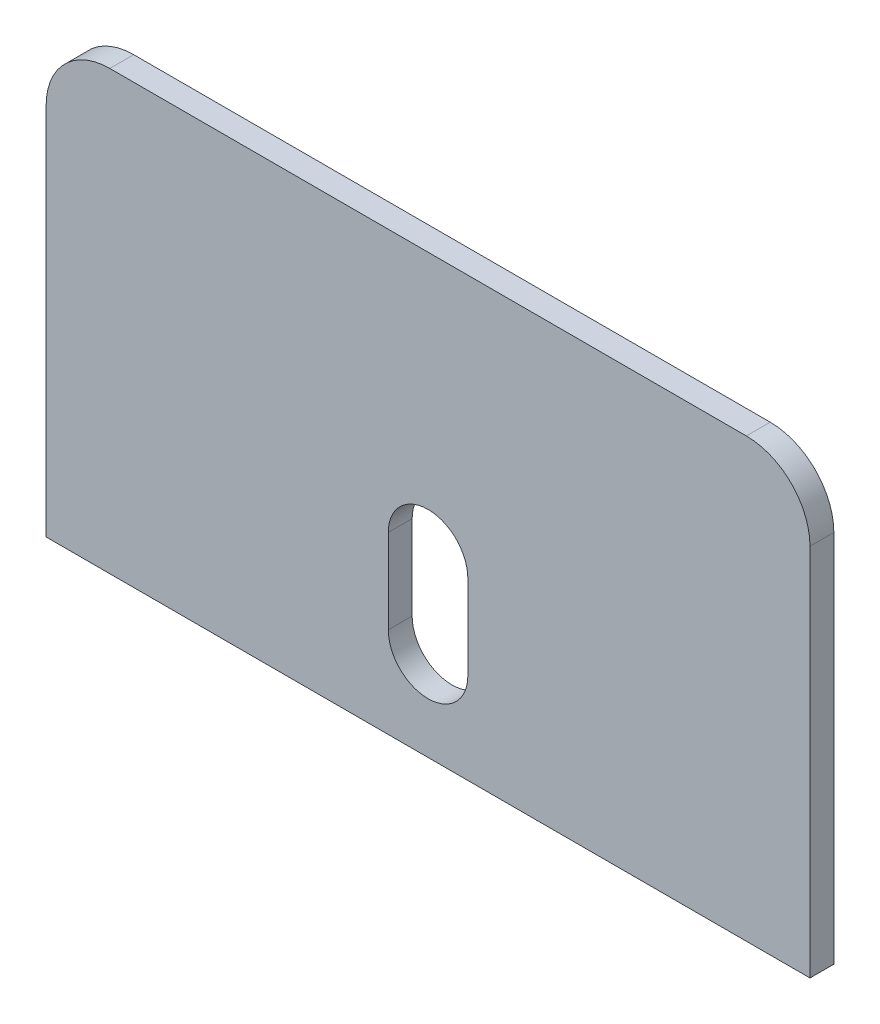
ISO-10303-21;
HEADER;
FILE_DESCRIPTION(('STEP AP214'),'2;1');
FILE_NAME('part.step','',(''),(''),'','','');
FILE_SCHEMA(('AUTOMOTIVE_DESIGN { 1 0 10303 214 1 1 1 1 }'));
ENDSEC;
DATA;
#1=APPLICATION_CONTEXT('core data for automotive mechanical design processes');
#2=APPLICATION_PROTOCOL_DEFINITION('international standard','automotive_design',2000,#1);
#3=PRODUCT_CONTEXT('',#1,'mechanical');
#4=PRODUCT('Part','Part','',(#3));
#5=PRODUCT_RELATED_PRODUCT_CATEGORY('part','',(#4));
#6=PRODUCT_DEFINITION_FORMATION('','',#4);
#7=PRODUCT_DEFINITION_CONTEXT('part definition',#1,'design');
#8=PRODUCT_DEFINITION('design','',#6,#7);
#9=PRODUCT_DEFINITION_SHAPE('','',#8);
#10=(LENGTH_UNIT() NAMED_UNIT(*) SI_UNIT(.MILLI.,.METRE.));
#11=(NAMED_UNIT(*) PLANE_ANGLE_UNIT() SI_UNIT($,.RADIAN.));
#12=(NAMED_UNIT(*) SI_UNIT($,.STERADIAN.) SOLID_ANGLE_UNIT());
#13=UNCERTAINTY_MEASURE_WITH_UNIT(LENGTH_MEASURE(1.E-05),#10,'distance_accuracy_value','');
#14=(GEOMETRIC_REPRESENTATION_CONTEXT(3) GLOBAL_UNCERTAINTY_ASSIGNED_CONTEXT((#13)) GLOBAL_UNIT_ASSIGNED_CONTEXT((#10,
#11,#12)) REPRESENTATION_CONTEXT('',''));
#15=CARTESIAN_POINT('',(0.,0.,0.));
#16=DIRECTION('',(0.,0.,1.));
#17=DIRECTION('',(1.,0.,0.));
#18=AXIS2_PLACEMENT_3D('',#15,#16,#17);
#19=CARTESIAN_POINT('',(0.,0.,1.5));
#20=DIRECTION('',(0.,0.,1.));
#21=DIRECTION('',(1.,0.,0.));
#22=AXIS2_PLACEMENT_3D('',#19,#20,#21);
#23=PLANE('',#22);
#24=DIRECTION('',(0.,1.,0.));
#25=VECTOR('',#24,1.);
#26=CARTESIAN_POINT('',(48.,-27.5,1.5));
#27=LINE('',#26,#25);
#28=CARTESIAN_POINT('',(48.,-27.5,1.5));
#29=VERTEX_POINT('',#28);
#30=CARTESIAN_POINT('',(48.,19.5,1.5));
#31=VERTEX_POINT('',#30);
#32=EDGE_CURVE('E997',#29,#31,#27,.T.);
#33=ORIENTED_EDGE('',*,*,#32,.T.);
#34=CARTESIAN_POINT('',(40.,19.5,1.5));
#35=DIRECTION('',(0.,0.,1.));
#36=DIRECTION('',(1.,0.,0.));
#37=AXIS2_PLACEMENT_3D('',#34,#35,#36);
#38=CIRCLE('',#37,8.);
#39=CARTESIAN_POINT('',(40.,27.5,1.5));
#40=VERTEX_POINT('',#39);
#41=EDGE_CURVE('E60',#31,#40,#38,.T.);
#42=ORIENTED_EDGE('',*,*,#41,.T.);
#43=DIRECTION('',(-1.,0.,0.));
#44=VECTOR('',#43,1.);
#45=CARTESIAN_POINT('',(48.,27.5,1.5));
#46=LINE('',#45,#44);
#47=CARTESIAN_POINT('',(-40.,27.5,1.5));
#48=VERTEX_POINT('',#47);
#49=EDGE_CURVE('E343',#40,#48,#46,.T.);
#50=ORIENTED_EDGE('',*,*,#49,.T.);
#51=CARTESIAN_POINT('',(-40.,19.5,1.5));
#52=DIRECTION('',(0.,0.,1.));
#53=DIRECTION('',(1.,0.,0.));
#54=AXIS2_PLACEMENT_3D('',#51,#52,#53);
#55=CIRCLE('',#54,8.);
#56=CARTESIAN_POINT('',(-48.,19.5,1.5));
#57=VERTEX_POINT('',#56);
#58=EDGE_CURVE('E67',#48,#57,#55,.T.);
#59=ORIENTED_EDGE('',*,*,#58,.T.);
#60=DIRECTION('',(0.,-1.,0.));
#61=VECTOR('',#60,1.);
#62=CARTESIAN_POINT('',(-48.,-27.5,1.5));
#63=LINE('',#62,#61);
#64=CARTESIAN_POINT('',(-48.,-27.5,1.5));
#65=VERTEX_POINT('',#64);
#66=EDGE_CURVE('E243',#57,#65,#63,.T.);
#67=ORIENTED_EDGE('',*,*,#66,.T.);
#68=DIRECTION('',(1.,0.,0.));
#69=VECTOR('',#68,1.);
#70=CARTESIAN_POINT('',(48.,-27.5,1.5));
#71=LINE('',#70,#69);
#72=EDGE_CURVE('E993',#65,#29,#71,.T.);
#73=ORIENTED_EDGE('',*,*,#72,.T.);
#74=EDGE_LOOP('',(#33,#42,#50,#59,#67,#73));
#75=FACE_BOUND('',#74,.T.);
#76=DIRECTION('',(0.,1.,0.));
#77=VECTOR('',#76,1.);
#78=CARTESIAN_POINT('',(5.,-16.1,1.5));
#79=LINE('',#78,#77);
#80=CARTESIAN_POINT('',(5.,-16.1,1.5));
#81=VERTEX_POINT('',#80);
#82=CARTESIAN_POINT('',(5.,-5.5,1.5));
#83=VERTEX_POINT('',#82);
#84=EDGE_CURVE('E145',#81,#83,#79,.T.);
#85=ORIENTED_EDGE('',*,*,#84,.F.);
#86=CARTESIAN_POINT('',(0.,-16.1,1.5));
#87=DIRECTION('',(0.,0.,1.));
#88=DIRECTION('',(1.,0.,0.));
#89=AXIS2_PLACEMENT_3D('',#86,#87,#88);
#90=CIRCLE('',#89,5.);
#91=CARTESIAN_POINT('',(-5.,-16.1,1.5));
#92=VERTEX_POINT('',#91);
#93=EDGE_CURVE('E134',#92,#81,#90,.T.);
#94=ORIENTED_EDGE('',*,*,#93,.F.);
#95=DIRECTION('',(0.,-1.,0.));
#96=VECTOR('',#95,1.);
#97=CARTESIAN_POINT('',(-5.,-16.1,1.5));
#98=LINE('',#97,#96);
#99=CARTESIAN_POINT('',(-5.,-5.5,1.5));
#100=VERTEX_POINT('',#99);
#101=EDGE_CURVE('E165',#100,#92,#98,.T.);
#102=ORIENTED_EDGE('',*,*,#101,.F.);
#103=CARTESIAN_POINT('',(0.,-5.50000000000001,1.5));
#104=DIRECTION('',(0.,0.,1.));
#105=DIRECTION('',(1.,0.,0.));
#106=AXIS2_PLACEMENT_3D('',#103,#104,#105);
#107=CIRCLE('',#106,5.);
#108=EDGE_CURVE('E159',#83,#100,#107,.T.);
#109=ORIENTED_EDGE('',*,*,#108,.F.);
#110=EDGE_LOOP('',(#85,#94,#102,#109));
#111=FACE_BOUND('',#110,.T.);
#112=ADVANCED_FACE('F51',(#75,#111),#23,.T.);
#113=CARTESIAN_POINT('',(0.,0.,-1.5));
#114=DIRECTION('',(0.,0.,1.));
#115=DIRECTION('',(1.,0.,0.));
#116=AXIS2_PLACEMENT_3D('',#113,#114,#115);
#117=PLANE('',#116);
#118=DIRECTION('',(-1.,0.,0.));
#119=VECTOR('',#118,1.);
#120=CARTESIAN_POINT('',(48.,27.5,-1.5));
#121=LINE('',#120,#119);
#122=CARTESIAN_POINT('',(40.,27.5,-1.5));
#123=VERTEX_POINT('',#122);
#124=CARTESIAN_POINT('',(-40.,27.5,-1.5));
#125=VERTEX_POINT('',#124);
#126=EDGE_CURVE('E344',#123,#125,#121,.T.);
#127=ORIENTED_EDGE('',*,*,#126,.F.);
#128=CARTESIAN_POINT('',(40.,19.5,-1.5));
#129=DIRECTION('',(0.,0.,1.));
#130=DIRECTION('',(1.,0.,0.));
#131=AXIS2_PLACEMENT_3D('',#128,#129,#130);
#132=CIRCLE('',#131,8.);
#133=CARTESIAN_POINT('',(48.,19.5,-1.5));
#134=VERTEX_POINT('',#133);
#135=EDGE_CURVE('E1013',#123,#134,#132,.F.);
#136=ORIENTED_EDGE('',*,*,#135,.T.);
#137=DIRECTION('',(0.,1.,0.));
#138=VECTOR('',#137,1.);
#139=CARTESIAN_POINT('',(48.,-27.5,-1.5));
#140=LINE('',#139,#138);
#141=CARTESIAN_POINT('',(48.,-27.5,-1.5));
#142=VERTEX_POINT('',#141);
#143=EDGE_CURVE('E982',#142,#134,#140,.T.);
#144=ORIENTED_EDGE('',*,*,#143,.F.);
#145=DIRECTION('',(1.,0.,0.));
#146=VECTOR('',#145,1.);
#147=CARTESIAN_POINT('',(48.,-27.5,-1.5));
#148=LINE('',#147,#146);
#149=CARTESIAN_POINT('',(-48.,-27.5,-1.5));
#150=VERTEX_POINT('',#149);
#151=EDGE_CURVE('E978',#150,#142,#148,.T.);
#152=ORIENTED_EDGE('',*,*,#151,.F.);
#153=DIRECTION('',(0.,-1.,0.));
#154=VECTOR('',#153,1.);
#155=CARTESIAN_POINT('',(-48.,-27.5,-1.5));
#156=LINE('',#155,#154);
#157=CARTESIAN_POINT('',(-48.,19.5,-1.5));
#158=VERTEX_POINT('',#157);
#159=EDGE_CURVE('E154',#158,#150,#156,.T.);
#160=ORIENTED_EDGE('',*,*,#159,.F.);
#161=CARTESIAN_POINT('',(-40.,19.5,-1.5));
#162=DIRECTION('',(0.,0.,1.));
#163=DIRECTION('',(1.,0.,0.));
#164=AXIS2_PLACEMENT_3D('',#161,#162,#163);
#165=CIRCLE('',#164,8.);
#166=EDGE_CURVE('E1018',#158,#125,#165,.F.);
#167=ORIENTED_EDGE('',*,*,#166,.T.);
#168=EDGE_LOOP('',(#127,#136,#144,#152,#160,#167));
#169=FACE_BOUND('',#168,.T.);
#170=CARTESIAN_POINT('',(0.,-16.1,-1.5));
#171=DIRECTION('',(0.,0.,1.));
#172=DIRECTION('',(1.,0.,0.));
#173=AXIS2_PLACEMENT_3D('',#170,#171,#172);
#174=CIRCLE('',#173,5.);
#175=CARTESIAN_POINT('',(-5.,-16.1,-1.5));
#176=VERTEX_POINT('',#175);
#177=CARTESIAN_POINT('',(5.,-16.1,-1.5));
#178=VERTEX_POINT('',#177);
#179=EDGE_CURVE('E195',#176,#178,#174,.T.);
#180=ORIENTED_EDGE('',*,*,#179,.T.);
#181=DIRECTION('',(0.,1.,0.));
#182=VECTOR('',#181,1.);
#183=CARTESIAN_POINT('',(5.,-16.1,-1.5));
#184=LINE('',#183,#182);
#185=CARTESIAN_POINT('',(5.,-5.5,-1.5));
#186=VERTEX_POINT('',#185);
#187=EDGE_CURVE('E152',#178,#186,#184,.T.);
#188=ORIENTED_EDGE('',*,*,#187,.T.);
#189=CARTESIAN_POINT('',(0.,-5.50000000000001,-1.5));
#190=DIRECTION('',(0.,0.,1.));
#191=DIRECTION('',(1.,0.,0.));
#192=AXIS2_PLACEMENT_3D('',#189,#190,#191);
#193=CIRCLE('',#192,5.);
#194=CARTESIAN_POINT('',(-5.,-5.5,-1.5));
#195=VERTEX_POINT('',#194);
#196=EDGE_CURVE('E398',#186,#195,#193,.T.);
#197=ORIENTED_EDGE('',*,*,#196,.T.);
#198=DIRECTION('',(0.,-1.,0.));
#199=VECTOR('',#198,1.);
#200=CARTESIAN_POINT('',(-5.,-16.1,-1.5));
#201=LINE('',#200,#199);
#202=EDGE_CURVE('E146',#195,#176,#201,.T.);
#203=ORIENTED_EDGE('',*,*,#202,.T.);
#204=EDGE_LOOP('',(#180,#188,#197,#203));
#205=FACE_BOUND('',#204,.T.);
#206=ADVANCED_FACE('F1036',(#169,#205),#117,.F.);
#207=CARTESIAN_POINT('',(-48.,-27.5,1.5));
#208=DIRECTION('',(1.,0.,0.));
#209=DIRECTION('',(0.,0.,-1.));
#210=AXIS2_PLACEMENT_3D('',#207,#208,#209);
#211=PLANE('',#210);
#212=ORIENTED_EDGE('',*,*,#66,.F.);
#213=DIRECTION('',(0.,0.,-1.));
#214=VECTOR('',#213,1.);
#215=CARTESIAN_POINT('',(-48.,19.5,1.5));
#216=LINE('',#215,#214);
#217=EDGE_CURVE('E12',#57,#158,#216,.T.);
#218=ORIENTED_EDGE('',*,*,#217,.T.);
#219=ORIENTED_EDGE('',*,*,#159,.T.);
#220=DIRECTION('',(0.,0.,-1.));
#221=VECTOR('',#220,1.);
#222=CARTESIAN_POINT('',(-48.,-27.5,1.5));
#223=LINE('',#222,#221);
#224=EDGE_CURVE('E342',#65,#150,#223,.T.);
#225=ORIENTED_EDGE('',*,*,#224,.F.);
#226=EDGE_LOOP('',(#212,#218,#219,#225));
#227=FACE_BOUND('',#226,.T.);
#228=ADVANCED_FACE('F1032',(#227),#211,.F.);
#229=CARTESIAN_POINT('',(48.,-27.5,1.5));
#230=DIRECTION('',(0.,1.,0.));
#231=DIRECTION('',(-1.,0.,0.));
#232=AXIS2_PLACEMENT_3D('',#229,#230,#231);
#233=PLANE('',#232);
#234=ORIENTED_EDGE('',*,*,#151,.T.);
#235=DIRECTION('',(0.,0.,-1.));
#236=VECTOR('',#235,1.);
#237=CARTESIAN_POINT('',(48.,-27.5,1.5));
#238=LINE('',#237,#236);
#239=EDGE_CURVE('E336',#29,#142,#238,.T.);
#240=ORIENTED_EDGE('',*,*,#239,.F.);
#241=ORIENTED_EDGE('',*,*,#72,.F.);
#242=ORIENTED_EDGE('',*,*,#224,.T.);
#243=EDGE_LOOP('',(#234,#240,#241,#242));
#244=FACE_BOUND('',#243,.T.);
#245=ADVANCED_FACE('F1029',(#244),#233,.F.);
#246=CARTESIAN_POINT('',(48.,-27.5,1.5));
#247=DIRECTION('',(-1.,0.,0.));
#248=DIRECTION('',(0.,0.,1.));
#249=AXIS2_PLACEMENT_3D('',#246,#247,#248);
#250=PLANE('',#249);
#251=ORIENTED_EDGE('',*,*,#143,.T.);
#252=DIRECTION('',(0.,0.,-1.));
#253=VECTOR('',#252,1.);
#254=CARTESIAN_POINT('',(48.,19.5,1.5));
#255=LINE('',#254,#253);
#256=EDGE_CURVE('E75',#134,#31,#255,.F.);
#257=ORIENTED_EDGE('',*,*,#256,.T.);
#258=ORIENTED_EDGE('',*,*,#32,.F.);
#259=ORIENTED_EDGE('',*,*,#239,.T.);
#260=EDGE_LOOP('',(#251,#257,#258,#259));
#261=FACE_BOUND('',#260,.T.);
#262=ADVANCED_FACE('F1042',(#261),#250,.F.);
#263=CARTESIAN_POINT('',(48.,27.5,1.5));
#264=DIRECTION('',(0.,-1.,0.));
#265=DIRECTION('',(1.,0.,0.));
#266=AXIS2_PLACEMENT_3D('',#263,#264,#265);
#267=PLANE('',#266);
#268=ORIENTED_EDGE('',*,*,#49,.F.);
#269=DIRECTION('',(0.,0.,-1.));
#270=VECTOR('',#269,1.);
#271=CARTESIAN_POINT('',(40.,27.5,1.5));
#272=LINE('',#271,#270);
#273=EDGE_CURVE('E1021',#40,#123,#272,.T.);
#274=ORIENTED_EDGE('',*,*,#273,.T.);
#275=ORIENTED_EDGE('',*,*,#126,.T.);
#276=DIRECTION('',(0.,0.,-1.));
#277=VECTOR('',#276,1.);
#278=CARTESIAN_POINT('',(-40.,27.5,1.5));
#279=LINE('',#278,#277);
#280=EDGE_CURVE('E1010',#125,#48,#279,.F.);
#281=ORIENTED_EDGE('',*,*,#280,.T.);
#282=EDGE_LOOP('',(#268,#274,#275,#281));
#283=FACE_BOUND('',#282,.T.);
#284=ADVANCED_FACE('F1040',(#283),#267,.F.);
#285=CARTESIAN_POINT('',(0.,-16.1,1.5));
#286=DIRECTION('',(0.,0.,-1.));
#287=DIRECTION('',(-1.,0.,0.));
#288=AXIS2_PLACEMENT_3D('',#285,#286,#287);
#289=CYLINDRICAL_SURFACE('',#288,5.);
#290=ORIENTED_EDGE('',*,*,#179,.F.);
#291=DIRECTION('',(0.,0.,-1.));
#292=VECTOR('',#291,1.);
#293=CARTESIAN_POINT('',(-5.,-16.1,1.5));
#294=LINE('',#293,#292);
#295=EDGE_CURVE('E140',#92,#176,#294,.T.);
#296=ORIENTED_EDGE('',*,*,#295,.F.);
#297=ORIENTED_EDGE('',*,*,#93,.T.);
#298=DIRECTION('',(0.,0.,-1.));
#299=VECTOR('',#298,1.);
#300=CARTESIAN_POINT('',(5.,-16.1,1.5));
#301=LINE('',#300,#299);
#302=EDGE_CURVE('E137',#81,#178,#301,.T.);
#303=ORIENTED_EDGE('',*,*,#302,.T.);
#304=EDGE_LOOP('',(#290,#296,#297,#303));
#305=FACE_BOUND('',#304,.T.);
#306=ADVANCED_FACE('F136',(#305),#289,.F.);
#307=CARTESIAN_POINT('',(5.,-16.1,1.5));
#308=DIRECTION('',(-1.,0.,0.));
#309=DIRECTION('',(0.,0.,1.));
#310=AXIS2_PLACEMENT_3D('',#307,#308,#309);
#311=PLANE('',#310);
#312=ORIENTED_EDGE('',*,*,#187,.F.);
#313=ORIENTED_EDGE('',*,*,#302,.F.);
#314=ORIENTED_EDGE('',*,*,#84,.T.);
#315=DIRECTION('',(0.,0.,-1.));
#316=VECTOR('',#315,1.);
#317=CARTESIAN_POINT('',(5.,-5.5,1.5));
#318=LINE('',#317,#316);
#319=EDGE_CURVE('E155',#83,#186,#318,.T.);
#320=ORIENTED_EDGE('',*,*,#319,.T.);
#321=EDGE_LOOP('',(#312,#313,#314,#320));
#322=FACE_BOUND('',#321,.T.);
#323=ADVANCED_FACE('F149',(#322),#311,.T.);
#324=CARTESIAN_POINT('',(0.,-5.50000000000001,1.5));
#325=DIRECTION('',(0.,0.,-1.));
#326=DIRECTION('',(-1.,0.,0.));
#327=AXIS2_PLACEMENT_3D('',#324,#325,#326);
#328=CYLINDRICAL_SURFACE('',#327,5.);
#329=ORIENTED_EDGE('',*,*,#196,.F.);
#330=ORIENTED_EDGE('',*,*,#319,.F.);
#331=ORIENTED_EDGE('',*,*,#108,.T.);
#332=DIRECTION('',(0.,0.,-1.));
#333=VECTOR('',#332,1.);
#334=CARTESIAN_POINT('',(-5.,-5.5,1.5));
#335=LINE('',#334,#333);
#336=EDGE_CURVE('E220',#100,#195,#335,.T.);
#337=ORIENTED_EDGE('',*,*,#336,.T.);
#338=EDGE_LOOP('',(#329,#330,#331,#337));
#339=FACE_BOUND('',#338,.T.);
#340=ADVANCED_FACE('F1059',(#339),#328,.F.);
#341=CARTESIAN_POINT('',(-5.,-16.1,1.5));
#342=DIRECTION('',(1.,0.,0.));
#343=DIRECTION('',(0.,0.,-1.));
#344=AXIS2_PLACEMENT_3D('',#341,#342,#343);
#345=PLANE('',#344);
#346=ORIENTED_EDGE('',*,*,#202,.F.);
#347=ORIENTED_EDGE('',*,*,#336,.F.);
#348=ORIENTED_EDGE('',*,*,#101,.T.);
#349=ORIENTED_EDGE('',*,*,#295,.T.);
#350=EDGE_LOOP('',(#346,#347,#348,#349));
#351=FACE_BOUND('',#350,.T.);
#352=ADVANCED_FACE('F1062',(#351),#345,.T.);
#353=CARTESIAN_POINT('',(40.,19.5,1.5));
#354=DIRECTION('',(0.,0.,-1.));
#355=DIRECTION('',(-1.,0.,0.));
#356=AXIS2_PLACEMENT_3D('',#353,#354,#355);
#357=CYLINDRICAL_SURFACE('',#356,8.);
#358=ORIENTED_EDGE('',*,*,#41,.F.);
#359=ORIENTED_EDGE('',*,*,#256,.F.);
#360=ORIENTED_EDGE('',*,*,#135,.F.);
#361=ORIENTED_EDGE('',*,*,#273,.F.);
#362=EDGE_LOOP('',(#358,#359,#360,#361));
#363=FACE_BOUND('',#362,.T.);
#364=ADVANCED_FACE('F1039',(#363),#357,.T.);
#365=CARTESIAN_POINT('',(-40.,19.5,1.5));
#366=DIRECTION('',(0.,0.,-1.));
#367=DIRECTION('',(-1.,0.,0.));
#368=AXIS2_PLACEMENT_3D('',#365,#366,#367);
#369=CYLINDRICAL_SURFACE('',#368,8.);
#370=ORIENTED_EDGE('',*,*,#58,.F.);
#371=ORIENTED_EDGE('',*,*,#280,.F.);
#372=ORIENTED_EDGE('',*,*,#166,.F.);
#373=ORIENTED_EDGE('',*,*,#217,.F.);
#374=EDGE_LOOP('',(#370,#371,#372,#373));
#375=FACE_BOUND('',#374,.T.);
#376=ADVANCED_FACE('F53',(#375),#369,.T.);
#377=CLOSED_SHELL('',(#112,#206,#228,#245,#262,#284,#306,#323,#340,#352,#364,#376));
#378=MANIFOLD_SOLID_BREP('B2',#377);
#379=ADVANCED_BREP_SHAPE_REPRESENTATION('',(#18,#378),#14);
#380=SHAPE_DEFINITION_REPRESENTATION(#9,#379);
ENDSEC;
END-ISO-10303-21;
